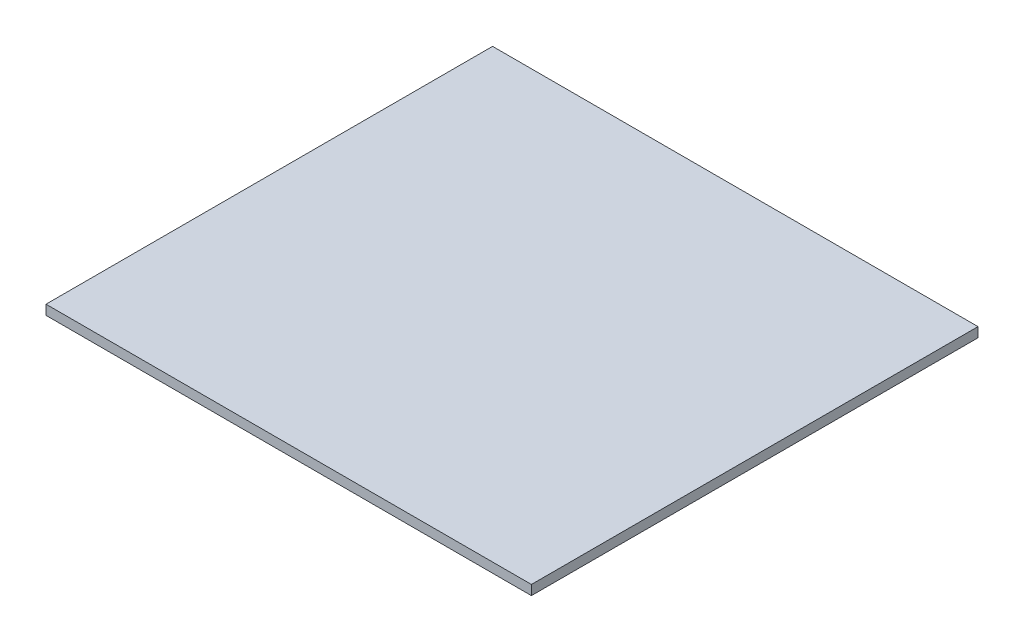
ISO-10303-21;
HEADER;
FILE_DESCRIPTION(('STEP AP214'),'2;1');
FILE_NAME('part.step','',(''),(''),'','','');
FILE_SCHEMA(('AUTOMOTIVE_DESIGN { 1 0 10303 214 1 1 1 1 }'));
ENDSEC;
DATA;
#1=APPLICATION_CONTEXT('core data for automotive mechanical design processes');
#2=APPLICATION_PROTOCOL_DEFINITION('international standard','automotive_design',2000,#1);
#3=PRODUCT_CONTEXT('',#1,'mechanical');
#4=PRODUCT('Part','Part','',(#3));
#5=PRODUCT_RELATED_PRODUCT_CATEGORY('part','',(#4));
#6=PRODUCT_DEFINITION_FORMATION('','',#4);
#7=PRODUCT_DEFINITION_CONTEXT('part definition',#1,'design');
#8=PRODUCT_DEFINITION('design','',#6,#7);
#9=PRODUCT_DEFINITION_SHAPE('','',#8);
#10=(LENGTH_UNIT() NAMED_UNIT(*) SI_UNIT(.MILLI.,.METRE.));
#11=(NAMED_UNIT(*) PLANE_ANGLE_UNIT() SI_UNIT($,.RADIAN.));
#12=(NAMED_UNIT(*) SI_UNIT($,.STERADIAN.) SOLID_ANGLE_UNIT());
#13=UNCERTAINTY_MEASURE_WITH_UNIT(LENGTH_MEASURE(1.E-05),#10,'distance_accuracy_value','');
#14=(GEOMETRIC_REPRESENTATION_CONTEXT(3) GLOBAL_UNCERTAINTY_ASSIGNED_CONTEXT((#13)) GLOBAL_UNIT_ASSIGNED_CONTEXT((#10,
#11,#12)) REPRESENTATION_CONTEXT('',''));
#15=CARTESIAN_POINT('',(0.,0.,0.));
#16=DIRECTION('',(0.,0.,1.));
#17=DIRECTION('',(1.,0.,0.));
#18=AXIS2_PLACEMENT_3D('',#15,#16,#17);
#19=CARTESIAN_POINT('',(125.,5.,115.));
#20=DIRECTION('',(-1.,0.,0.));
#21=DIRECTION('',(0.,0.,1.));
#22=AXIS2_PLACEMENT_3D('',#19,#20,#21);
#23=PLANE('',#22);
#24=DIRECTION('',(0.,0.,-1.));
#25=VECTOR('',#24,1.);
#26=CARTESIAN_POINT('',(125.,0.,115.));
#27=LINE('',#26,#25);
#28=CARTESIAN_POINT('',(125.,0.,115.));
#29=VERTEX_POINT('',#28);
#30=CARTESIAN_POINT('',(125.,0.,-115.));
#31=VERTEX_POINT('',#30);
#32=EDGE_CURVE('E99',#29,#31,#27,.T.);
#33=ORIENTED_EDGE('',*,*,#32,.T.);
#34=DIRECTION('',(0.,-1.,0.));
#35=VECTOR('',#34,1.);
#36=CARTESIAN_POINT('',(125.,5.,-115.));
#37=LINE('',#36,#35);
#38=CARTESIAN_POINT('',(125.,5.,-115.));
#39=VERTEX_POINT('',#38);
#40=EDGE_CURVE('E11',#39,#31,#37,.T.);
#41=ORIENTED_EDGE('',*,*,#40,.F.);
#42=DIRECTION('',(0.,0.,-1.));
#43=VECTOR('',#42,1.);
#44=CARTESIAN_POINT('',(125.,5.,115.));
#45=LINE('',#44,#43);
#46=CARTESIAN_POINT('',(125.,5.,115.));
#47=VERTEX_POINT('',#46);
#48=EDGE_CURVE('E87',#47,#39,#45,.T.);
#49=ORIENTED_EDGE('',*,*,#48,.F.);
#50=DIRECTION('',(0.,-1.,0.));
#51=VECTOR('',#50,1.);
#52=CARTESIAN_POINT('',(125.,5.,115.));
#53=LINE('',#52,#51);
#54=EDGE_CURVE('E95',#47,#29,#53,.T.);
#55=ORIENTED_EDGE('',*,*,#54,.T.);
#56=EDGE_LOOP('',(#33,#41,#49,#55));
#57=FACE_BOUND('',#56,.T.);
#58=ADVANCED_FACE('F36',(#57),#23,.F.);
#59=CARTESIAN_POINT('',(-125.,5.,-115.));
#60=DIRECTION('',(0.,0.,1.));
#61=DIRECTION('',(1.,0.,0.));
#62=AXIS2_PLACEMENT_3D('',#59,#60,#61);
#63=PLANE('',#62);
#64=DIRECTION('',(-1.,0.,0.));
#65=VECTOR('',#64,1.);
#66=CARTESIAN_POINT('',(-125.,0.,-115.));
#67=LINE('',#66,#65);
#68=CARTESIAN_POINT('',(-125.,0.,-115.));
#69=VERTEX_POINT('',#68);
#70=EDGE_CURVE('E91',#31,#69,#67,.T.);
#71=ORIENTED_EDGE('',*,*,#70,.T.);
#72=DIRECTION('',(0.,-1.,0.));
#73=VECTOR('',#72,1.);
#74=CARTESIAN_POINT('',(-125.,5.,-115.));
#75=LINE('',#74,#73);
#76=CARTESIAN_POINT('',(-125.,5.,-115.));
#77=VERTEX_POINT('',#76);
#78=EDGE_CURVE('E44',#77,#69,#75,.T.);
#79=ORIENTED_EDGE('',*,*,#78,.F.);
#80=DIRECTION('',(-1.,0.,0.));
#81=VECTOR('',#80,1.);
#82=CARTESIAN_POINT('',(-125.,5.,-115.));
#83=LINE('',#82,#81);
#84=EDGE_CURVE('E82',#39,#77,#83,.T.);
#85=ORIENTED_EDGE('',*,*,#84,.F.);
#86=ORIENTED_EDGE('',*,*,#40,.T.);
#87=EDGE_LOOP('',(#71,#79,#85,#86));
#88=FACE_BOUND('',#87,.T.);
#89=ADVANCED_FACE('F90',(#88),#63,.F.);
#90=CARTESIAN_POINT('',(-125.,5.,115.));
#91=DIRECTION('',(1.,0.,0.));
#92=DIRECTION('',(0.,0.,-1.));
#93=AXIS2_PLACEMENT_3D('',#90,#91,#92);
#94=PLANE('',#93);
#95=DIRECTION('',(0.,0.,1.));
#96=VECTOR('',#95,1.);
#97=CARTESIAN_POINT('',(-125.,0.,115.));
#98=LINE('',#97,#96);
#99=CARTESIAN_POINT('',(-125.,0.,115.));
#100=VERTEX_POINT('',#99);
#101=EDGE_CURVE('E69',#69,#100,#98,.T.);
#102=ORIENTED_EDGE('',*,*,#101,.T.);
#103=DIRECTION('',(0.,-1.,0.));
#104=VECTOR('',#103,1.);
#105=CARTESIAN_POINT('',(-125.,5.,115.));
#106=LINE('',#105,#104);
#107=CARTESIAN_POINT('',(-125.,5.,115.));
#108=VERTEX_POINT('',#107);
#109=EDGE_CURVE('E92',#108,#100,#106,.T.);
#110=ORIENTED_EDGE('',*,*,#109,.F.);
#111=DIRECTION('',(0.,0.,1.));
#112=VECTOR('',#111,1.);
#113=CARTESIAN_POINT('',(-125.,5.,115.));
#114=LINE('',#113,#112);
#115=EDGE_CURVE('E85',#77,#108,#114,.T.);
#116=ORIENTED_EDGE('',*,*,#115,.F.);
#117=ORIENTED_EDGE('',*,*,#78,.T.);
#118=EDGE_LOOP('',(#102,#110,#116,#117));
#119=FACE_BOUND('',#118,.T.);
#120=ADVANCED_FACE('F93',(#119),#94,.F.);
#121=CARTESIAN_POINT('',(-125.,5.,115.));
#122=DIRECTION('',(0.,0.,-1.));
#123=DIRECTION('',(-1.,0.,0.));
#124=AXIS2_PLACEMENT_3D('',#121,#122,#123);
#125=PLANE('',#124);
#126=DIRECTION('',(1.,0.,0.));
#127=VECTOR('',#126,1.);
#128=CARTESIAN_POINT('',(-125.,0.,115.));
#129=LINE('',#128,#127);
#130=EDGE_CURVE('E75',#100,#29,#129,.T.);
#131=ORIENTED_EDGE('',*,*,#130,.T.);
#132=ORIENTED_EDGE('',*,*,#54,.F.);
#133=DIRECTION('',(1.,0.,0.));
#134=VECTOR('',#133,1.);
#135=CARTESIAN_POINT('',(-125.,5.,115.));
#136=LINE('',#135,#134);
#137=EDGE_CURVE('E52',#108,#47,#136,.T.);
#138=ORIENTED_EDGE('',*,*,#137,.F.);
#139=ORIENTED_EDGE('',*,*,#109,.T.);
#140=EDGE_LOOP('',(#131,#132,#138,#139));
#141=FACE_BOUND('',#140,.T.);
#142=ADVANCED_FACE('F106',(#141),#125,.F.);
#143=CARTESIAN_POINT('',(0.,5.,0.));
#144=DIRECTION('',(0.,-1.,0.));
#145=DIRECTION('',(0.,0.,-1.));
#146=AXIS2_PLACEMENT_3D('',#143,#144,#145);
#147=PLANE('',#146);
#148=ORIENTED_EDGE('',*,*,#48,.T.);
#149=ORIENTED_EDGE('',*,*,#84,.T.);
#150=ORIENTED_EDGE('',*,*,#115,.T.);
#151=ORIENTED_EDGE('',*,*,#137,.T.);
#152=EDGE_LOOP('',(#148,#149,#150,#151));
#153=FACE_BOUND('',#152,.T.);
#154=ADVANCED_FACE('F83',(#153),#147,.F.);
#155=CARTESIAN_POINT('',(0.,0.,0.));
#156=DIRECTION('',(0.,-1.,0.));
#157=DIRECTION('',(0.,0.,-1.));
#158=AXIS2_PLACEMENT_3D('',#155,#156,#157);
#159=PLANE('',#158);
#160=ORIENTED_EDGE('',*,*,#32,.F.);
#161=ORIENTED_EDGE('',*,*,#130,.F.);
#162=ORIENTED_EDGE('',*,*,#101,.F.);
#163=ORIENTED_EDGE('',*,*,#70,.F.);
#164=EDGE_LOOP('',(#160,#161,#162,#163));
#165=FACE_BOUND('',#164,.T.);
#166=ADVANCED_FACE('F109',(#165),#159,.T.);
#167=CLOSED_SHELL('',(#58,#89,#120,#142,#154,#166));
#168=MANIFOLD_SOLID_BREP('B2',#167);
#169=ADVANCED_BREP_SHAPE_REPRESENTATION('',(#18,#168),#14);
#170=SHAPE_DEFINITION_REPRESENTATION(#9,#169);
ENDSEC;
END-ISO-10303-21;
